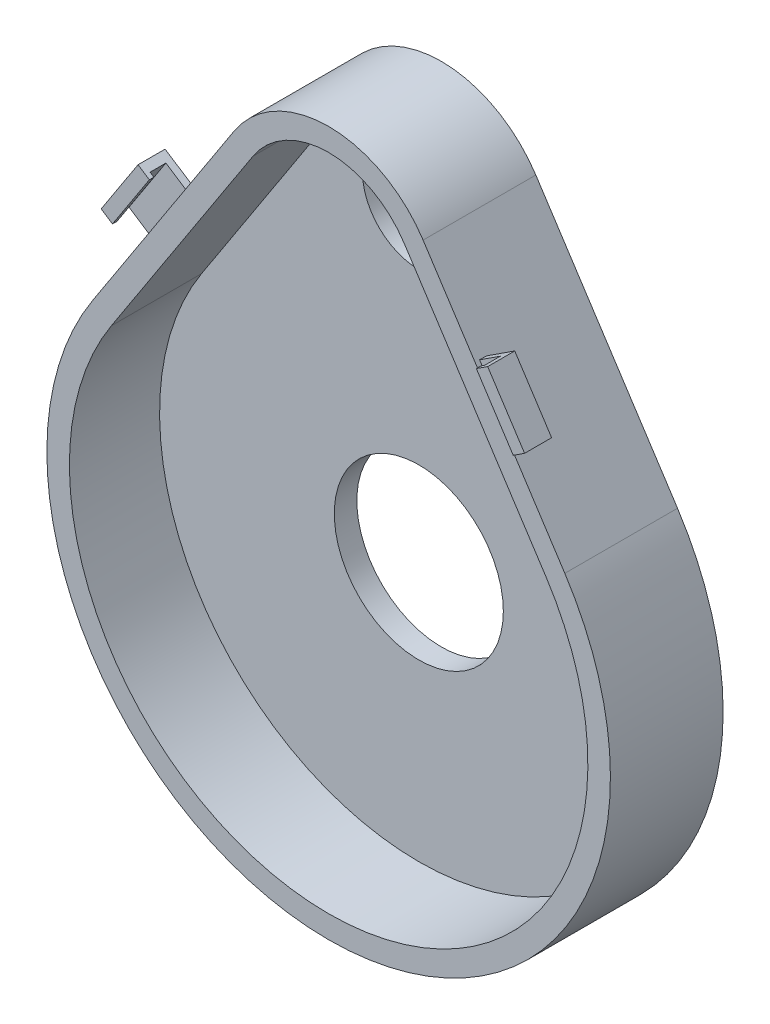
ISO-10303-21;
HEADER;
FILE_DESCRIPTION(('STEP AP214'),'2;1');
FILE_NAME('part.step','',(''),(''),'','','');
FILE_SCHEMA(('AUTOMOTIVE_DESIGN { 1 0 10303 214 1 1 1 1 }'));
ENDSEC;
DATA;
#1=APPLICATION_CONTEXT('core data for automotive mechanical design processes');
#2=APPLICATION_PROTOCOL_DEFINITION('international standard','automotive_design',2000,#1);
#3=PRODUCT_CONTEXT('',#1,'mechanical');
#4=PRODUCT('Part','Part','',(#3));
#5=PRODUCT_RELATED_PRODUCT_CATEGORY('part','',(#4));
#6=PRODUCT_DEFINITION_FORMATION('','',#4);
#7=PRODUCT_DEFINITION_CONTEXT('part definition',#1,'design');
#8=PRODUCT_DEFINITION('design','',#6,#7);
#9=PRODUCT_DEFINITION_SHAPE('','',#8);
#10=(LENGTH_UNIT() NAMED_UNIT(*) SI_UNIT(.MILLI.,.METRE.));
#11=(NAMED_UNIT(*) PLANE_ANGLE_UNIT() SI_UNIT($,.RADIAN.));
#12=(NAMED_UNIT(*) SI_UNIT($,.STERADIAN.) SOLID_ANGLE_UNIT());
#13=UNCERTAINTY_MEASURE_WITH_UNIT(LENGTH_MEASURE(1.E-05),#10,'distance_accuracy_value','');
#14=(GEOMETRIC_REPRESENTATION_CONTEXT(3) GLOBAL_UNCERTAINTY_ASSIGNED_CONTEXT((#13)) GLOBAL_UNIT_ASSIGNED_CONTEXT((#10,
#11,#12)) REPRESENTATION_CONTEXT('',''));
#15=CARTESIAN_POINT('',(0.,0.,0.));
#16=DIRECTION('',(0.,0.,1.));
#17=DIRECTION('',(1.,0.,0.));
#18=AXIS2_PLACEMENT_3D('',#15,#16,#17);
#19=CARTESIAN_POINT('',(0.,0.,7.239));
#20=DIRECTION('',(0.,0.,1.));
#21=DIRECTION('',(1.,0.,0.));
#22=AXIS2_PLACEMENT_3D('',#19,#20,#21);
#23=PLANE('',#22);
#24=DIRECTION('',(0.838140405208444,-0.545454545454546,0.));
#25=VECTOR('',#24,1.);
#26=CARTESIAN_POINT('',(-11.9273669292934,14.2691850561558,7.239));
#27=LINE('',#26,#25);
#28=CARTESIAN_POINT('',(-11.9273669292934,14.2691850561558,7.239));
#29=VERTEX_POINT('',#28);
#30=CARTESIAN_POINT('',(-11.2887039405245,13.8535486925195,7.239));
#31=VERTEX_POINT('',#30);
#32=EDGE_CURVE('E216',#29,#31,#27,.T.);
#33=ORIENTED_EDGE('',*,*,#32,.T.);
#34=DIRECTION('',(0.545454545454546,0.838140405208444,0.));
#35=VECTOR('',#34,1.);
#36=CARTESIAN_POINT('',(-26.2449025631422,-9.12800765970158,7.239));
#37=LINE('',#36,#35);
#38=CARTESIAN_POINT('',(-9.2105221223427,17.0468636363636,7.239));
#39=VERTEX_POINT('',#38);
#40=EDGE_CURVE('E204',#31,#39,#37,.T.);
#41=ORIENTED_EDGE('',*,*,#40,.T.);
#42=DIRECTION('',(-0.838140405208444,0.545454545454546,0.));
#43=VECTOR('',#42,1.);
#44=CARTESIAN_POINT('',(-8.25252763918945,16.4234090909091,7.239));
#45=LINE('',#44,#43);
#46=CARTESIAN_POINT('',(-9.84918511111154,17.4625,7.239));
#47=VERTEX_POINT('',#46);
#48=EDGE_CURVE('E226',#39,#47,#45,.T.);
#49=ORIENTED_EDGE('',*,*,#48,.T.);
#50=DIRECTION('',(-0.545454545454546,-0.838140405208444,0.));
#51=VECTOR('',#50,1.);
#52=CARTESIAN_POINT('',(-9.84918511111154,17.4625,7.239));
#53=LINE('',#52,#51);
#54=EDGE_CURVE('E228',#47,#29,#53,.T.);
#55=ORIENTED_EDGE('',*,*,#54,.T.);
#56=EDGE_LOOP('',(#33,#41,#49,#55));
#57=FACE_BOUND('',#56,.T.);
#58=ADVANCED_FACE('F39',(#57),#23,.T.);
#59=CARTESIAN_POINT('',(0.,0.,7.239));
#60=DIRECTION('',(0.,0.,-1.));
#61=DIRECTION('',(-1.,0.,0.));
#62=AXIS2_PLACEMENT_3D('',#59,#60,#61);
#63=PLANE('',#62);
#64=DIRECTION('',(-0.545454545454546,0.838140405208444,0.));
#65=VECTOR('',#64,1.);
#66=CARTESIAN_POINT('',(26.2449025631422,-9.12800765970158,7.239));
#67=LINE('',#66,#65);
#68=CARTESIAN_POINT('',(11.2887039405245,13.8535486925195,7.239));
#69=VERTEX_POINT('',#68);
#70=CARTESIAN_POINT('',(9.2105221223427,17.0468636363636,7.239));
#71=VERTEX_POINT('',#70);
#72=EDGE_CURVE('E660',#69,#71,#67,.T.);
#73=ORIENTED_EDGE('',*,*,#72,.F.);
#74=DIRECTION('',(0.838140405208444,0.545454545454546,0.));
#75=VECTOR('',#74,1.);
#76=CARTESIAN_POINT('',(11.9273669292934,14.2691850561558,7.239));
#77=LINE('',#76,#75);
#78=CARTESIAN_POINT('',(11.9273669292934,14.2691850561558,7.239));
#79=VERTEX_POINT('',#78);
#80=EDGE_CURVE('E667',#69,#79,#77,.T.);
#81=ORIENTED_EDGE('',*,*,#80,.T.);
#82=DIRECTION('',(-0.545454545454546,0.838140405208444,0.));
#83=VECTOR('',#82,1.);
#84=CARTESIAN_POINT('',(9.84918511111154,17.4625,7.239));
#85=LINE('',#84,#83);
#86=CARTESIAN_POINT('',(9.84918511111154,17.4625,7.239));
#87=VERTEX_POINT('',#86);
#88=EDGE_CURVE('E669',#79,#87,#85,.T.);
#89=ORIENTED_EDGE('',*,*,#88,.T.);
#90=DIRECTION('',(-0.838140405208444,-0.545454545454546,0.));
#91=VECTOR('',#90,1.);
#92=CARTESIAN_POINT('',(8.25252763918945,16.4234090909091,7.239));
#93=LINE('',#92,#91);
#94=EDGE_CURVE('E672',#87,#71,#93,.T.);
#95=ORIENTED_EDGE('',*,*,#94,.T.);
#96=EDGE_LOOP('',(#73,#81,#89,#95));
#97=FACE_BOUND('',#96,.T.);
#98=ADVANCED_FACE('F376',(#97),#63,.F.);
#99=CARTESIAN_POINT('',(11.9273669292934,14.2691850561558,7.239));
#100=DIRECTION('',(-0.545454545454546,0.838140405208444,0.));
#101=DIRECTION('',(-0.838140405208444,-0.545454545454546,0.));
#102=AXIS2_PLACEMENT_3D('',#99,#100,#101);
#103=PLANE('',#102);
#104=DIRECTION('',(0.838140405208444,0.545454545454546,0.));
#105=VECTOR('',#104,1.);
#106=CARTESIAN_POINT('',(10.3307094573713,13.2300941470649,6.096));
#107=LINE('',#106,#105);
#108=CARTESIAN_POINT('',(10.3307094573713,13.2300941470649,6.096));
#109=VERTEX_POINT('',#108);
#110=CARTESIAN_POINT('',(11.5015916034475,13.9920941470649,6.096));
#111=VERTEX_POINT('',#110);
#112=EDGE_CURVE('E653',#109,#111,#107,.T.);
#113=ORIENTED_EDGE('',*,*,#112,.F.);
#114=DIRECTION('',(0.,0.,-1.));
#115=VECTOR('',#114,1.);
#116=CARTESIAN_POINT('',(10.3307094573713,13.2300941470649,7.239));
#117=LINE('',#116,#115);
#118=CARTESIAN_POINT('',(10.3307094573713,13.2300941470649,5.715));
#119=VERTEX_POINT('',#118);
#120=EDGE_CURVE('E688',#109,#119,#117,.T.);
#121=ORIENTED_EDGE('',*,*,#120,.T.);
#122=DIRECTION('',(0.838140405208444,0.545454545454546,0.));
#123=VECTOR('',#122,1.);
#124=CARTESIAN_POINT('',(11.9273669292934,14.2691850561558,5.715));
#125=LINE('',#124,#123);
#126=CARTESIAN_POINT('',(11.9273669292934,14.2691850561558,5.715));
#127=VERTEX_POINT('',#126);
#128=EDGE_CURVE('E680',#119,#127,#125,.T.);
#129=ORIENTED_EDGE('',*,*,#128,.T.);
#130=DIRECTION('',(0.,0.,-1.));
#131=VECTOR('',#130,1.);
#132=CARTESIAN_POINT('',(11.9273669292934,14.2691850561558,7.239));
#133=LINE('',#132,#131);
#134=EDGE_CURVE('E243',#79,#127,#133,.T.);
#135=ORIENTED_EDGE('',*,*,#134,.F.);
#136=ORIENTED_EDGE('',*,*,#80,.F.);
#137=DIRECTION('',(0.,0.,1.));
#138=VECTOR('',#137,1.);
#139=CARTESIAN_POINT('',(11.2887039405245,13.8535486925195,6.985));
#140=LINE('',#139,#138);
#141=CARTESIAN_POINT('',(11.2887039405245,13.8535486925195,6.985));
#142=VERTEX_POINT('',#141);
#143=EDGE_CURVE('E639',#142,#69,#140,.T.);
#144=ORIENTED_EDGE('',*,*,#143,.F.);
#145=DIRECTION('',(-0.838140405208444,-0.545454545454546,0.));
#146=VECTOR('',#145,1.);
#147=CARTESIAN_POINT('',(11.5015916034475,13.9920941470649,6.985));
#148=LINE('',#147,#146);
#149=CARTESIAN_POINT('',(11.5015916034475,13.9920941470649,6.985));
#150=VERTEX_POINT('',#149);
#151=EDGE_CURVE('E640',#150,#142,#148,.T.);
#152=ORIENTED_EDGE('',*,*,#151,.F.);
#153=DIRECTION('',(0.,0.,1.));
#154=VECTOR('',#153,1.);
#155=CARTESIAN_POINT('',(11.5015916034475,13.9920941470649,6.096));
#156=LINE('',#155,#154);
#157=EDGE_CURVE('E632',#111,#150,#156,.T.);
#158=ORIENTED_EDGE('',*,*,#157,.F.);
#159=EDGE_LOOP('',(#113,#121,#129,#135,#136,#144,#152,#158));
#160=FACE_BOUND('',#159,.T.);
#161=ADVANCED_FACE('F385',(#160),#103,.F.);
#162=CARTESIAN_POINT('',(8.25252763918945,16.4234090909091,7.239));
#163=DIRECTION('',(0.545454545454546,-0.838140405208444,0.));
#164=DIRECTION('',(0.838140405208444,0.545454545454546,0.));
#165=AXIS2_PLACEMENT_3D('',#162,#163,#164);
#166=PLANE('',#165);
#167=DIRECTION('',(0.,0.,-1.));
#168=VECTOR('',#167,1.);
#169=CARTESIAN_POINT('',(9.2105221223427,17.0468636363636,6.985));
#170=LINE('',#169,#168);
#171=CARTESIAN_POINT('',(9.2105221223427,17.0468636363636,6.985));
#172=VERTEX_POINT('',#171);
#173=EDGE_CURVE('E61',#71,#172,#170,.T.);
#174=ORIENTED_EDGE('',*,*,#173,.F.);
#175=ORIENTED_EDGE('',*,*,#94,.F.);
#176=DIRECTION('',(0.,0.,-1.));
#177=VECTOR('',#176,1.);
#178=CARTESIAN_POINT('',(9.84918511111154,17.4625,7.239));
#179=LINE('',#178,#177);
#180=CARTESIAN_POINT('',(9.84918511111154,17.4625,5.715));
#181=VERTEX_POINT('',#180);
#182=EDGE_CURVE('E671',#87,#181,#179,.T.);
#183=ORIENTED_EDGE('',*,*,#182,.T.);
#184=DIRECTION('',(-0.838140405208444,-0.545454545454546,0.));
#185=VECTOR('',#184,1.);
#186=CARTESIAN_POINT('',(8.25252763918945,16.4234090909091,5.715));
#187=LINE('',#186,#185);
#188=CARTESIAN_POINT('',(8.25252763918945,16.4234090909091,5.715));
#189=VERTEX_POINT('',#188);
#190=EDGE_CURVE('E666',#181,#189,#187,.T.);
#191=ORIENTED_EDGE('',*,*,#190,.T.);
#192=DIRECTION('',(0.,0.,-1.));
#193=VECTOR('',#192,1.);
#194=CARTESIAN_POINT('',(8.25252763918945,16.4234090909091,7.239));
#195=LINE('',#194,#193);
#196=CARTESIAN_POINT('',(8.25252763918945,16.4234090909091,6.096));
#197=VERTEX_POINT('',#196);
#198=EDGE_CURVE('E298',#197,#189,#195,.T.);
#199=ORIENTED_EDGE('',*,*,#198,.F.);
#200=DIRECTION('',(-0.838140405208445,-0.545454545454544,0.));
#201=VECTOR('',#200,1.);
#202=CARTESIAN_POINT('',(8.25252763918945,16.4234090909091,6.096));
#203=LINE('',#202,#201);
#204=CARTESIAN_POINT('',(9.42340978526565,17.1854090909091,6.096));
#205=VERTEX_POINT('',#204);
#206=EDGE_CURVE('E643',#205,#197,#203,.T.);
#207=ORIENTED_EDGE('',*,*,#206,.F.);
#208=DIRECTION('',(0.,0.,-1.));
#209=VECTOR('',#208,1.);
#210=CARTESIAN_POINT('',(9.42340978526565,17.1854090909091,6.096));
#211=LINE('',#210,#209);
#212=CARTESIAN_POINT('',(9.42340978526565,17.1854090909091,6.985));
#213=VERTEX_POINT('',#212);
#214=EDGE_CURVE('E645',#213,#205,#211,.T.);
#215=ORIENTED_EDGE('',*,*,#214,.F.);
#216=DIRECTION('',(0.838140405208449,0.545454545454538,0.));
#217=VECTOR('',#216,1.);
#218=CARTESIAN_POINT('',(9.42340978526565,17.1854090909091,6.985));
#219=LINE('',#218,#217);
#220=EDGE_CURVE('E646',#172,#213,#219,.T.);
#221=ORIENTED_EDGE('',*,*,#220,.F.);
#222=EDGE_LOOP('',(#174,#175,#183,#191,#199,#207,#215,#221));
#223=FACE_BOUND('',#222,.T.);
#224=ADVANCED_FACE('F438',(#223),#166,.F.);
#225=CARTESIAN_POINT('',(13.3054789326841,8.65909090909092,6.35));
#226=DIRECTION('',(-0.838140405208444,-0.545454545454546,0.));
#227=DIRECTION('',(0.545454545454546,-0.838140405208444,0.));
#228=AXIS2_PLACEMENT_3D('',#225,#226,#227);
#229=PLANE('',#228);
#230=ORIENTED_EDGE('',*,*,#120,.F.);
#231=DIRECTION('',(-0.545454545454546,0.838140405208444,0.));
#232=VECTOR('',#231,1.);
#233=CARTESIAN_POINT('',(25.286908079989,-9.75146220515613,6.096));
#234=LINE('',#233,#232);
#235=EDGE_CURVE('E657',#109,#197,#234,.T.);
#236=ORIENTED_EDGE('',*,*,#235,.T.);
#237=ORIENTED_EDGE('',*,*,#198,.T.);
#238=DIRECTION('',(0.545454545454546,-0.838140405208444,0.));
#239=VECTOR('',#238,1.);
#240=CARTESIAN_POINT('',(8.25252763918945,16.4234090909091,5.715));
#241=LINE('',#240,#239);
#242=EDGE_CURVE('E673',#189,#119,#241,.T.);
#243=ORIENTED_EDGE('',*,*,#242,.T.);
#244=EDGE_LOOP('',(#230,#236,#237,#243));
#245=FACE_BOUND('',#244,.T.);
#246=DIRECTION('',(0.,0.,-1.));
#247=VECTOR('',#246,1.);
#248=CARTESIAN_POINT('',(5.32219157307362,20.9261363636364,6.35));
#249=LINE('',#248,#247);
#250=CARTESIAN_POINT('',(5.32219157307362,20.9261363636364,6.35));
#251=VERTEX_POINT('',#250);
#252=CARTESIAN_POINT('',(5.32219157307362,20.9261363636364,0.));
#253=VERTEX_POINT('',#252);
#254=EDGE_CURVE('E297',#251,#253,#249,.T.);
#255=ORIENTED_EDGE('',*,*,#254,.F.);
#256=DIRECTION('',(-0.545454545454546,0.838140405208444,0.));
#257=VECTOR('',#256,1.);
#258=CARTESIAN_POINT('',(13.3054789326841,8.65909090909092,6.35));
#259=LINE('',#258,#257);
#260=CARTESIAN_POINT('',(13.3054789326841,8.65909090909092,6.35));
#261=VERTEX_POINT('',#260);
#262=EDGE_CURVE('E282',#261,#251,#259,.T.);
#263=ORIENTED_EDGE('',*,*,#262,.F.);
#264=DIRECTION('',(0.,0.,-1.));
#265=VECTOR('',#264,1.);
#266=CARTESIAN_POINT('',(13.3054789326841,8.65909090909092,6.35));
#267=LINE('',#266,#265);
#268=CARTESIAN_POINT('',(13.3054789326841,8.65909090909092,0.));
#269=VERTEX_POINT('',#268);
#270=EDGE_CURVE('E300',#261,#269,#267,.T.);
#271=ORIENTED_EDGE('',*,*,#270,.T.);
#272=DIRECTION('',(-0.545454545454546,0.838140405208444,0.));
#273=VECTOR('',#272,1.);
#274=CARTESIAN_POINT('',(13.3054789326841,8.65909090909092,0.));
#275=LINE('',#274,#273);
#276=EDGE_CURVE('E293',#269,#253,#275,.T.);
#277=ORIENTED_EDGE('',*,*,#276,.T.);
#278=EDGE_LOOP('',(#255,#263,#271,#277));
#279=FACE_BOUND('',#278,.T.);
#280=ADVANCED_FACE('F338',(#245,#279),#229,.F.);
#281=CARTESIAN_POINT('',(0.,17.4625,6.35));
#282=DIRECTION('',(0.,0.,1.));
#283=DIRECTION('',(1.,0.,0.));
#284=AXIS2_PLACEMENT_3D('',#281,#282,#283);
#285=PLANE('',#284);
#286=DIRECTION('',(0.545454545454546,0.838140405208444,0.));
#287=VECTOR('',#286,1.);
#288=CARTESIAN_POINT('',(-13.3054789326841,8.65909090909091,6.35));
#289=LINE('',#288,#287);
#290=CARTESIAN_POINT('',(-13.3054789326841,8.65909090909091,6.35));
#291=VERTEX_POINT('',#290);
#292=CARTESIAN_POINT('',(-5.32219157307362,20.9261363636363,6.35));
#293=VERTEX_POINT('',#292);
#294=EDGE_CURVE('E273',#291,#293,#289,.T.);
#295=ORIENTED_EDGE('',*,*,#294,.F.);
#296=CARTESIAN_POINT('',(0.,0.,6.35));
#297=DIRECTION('',(0.,0.,1.));
#298=DIRECTION('',(1.,0.,0.));
#299=AXIS2_PLACEMENT_3D('',#296,#297,#298);
#300=CIRCLE('',#299,15.875);
#301=EDGE_CURVE('E285',#291,#261,#300,.T.);
#302=ORIENTED_EDGE('',*,*,#301,.T.);
#303=ORIENTED_EDGE('',*,*,#262,.T.);
#304=CARTESIAN_POINT('',(0.,17.4625,6.35));
#305=DIRECTION('',(0.,0.,1.));
#306=DIRECTION('',(1.,0.,0.));
#307=AXIS2_PLACEMENT_3D('',#304,#305,#306);
#308=CIRCLE('',#307,6.35);
#309=EDGE_CURVE('E280',#251,#293,#308,.T.);
#310=ORIENTED_EDGE('',*,*,#309,.T.);
#311=EDGE_LOOP('',(#295,#302,#303,#310));
#312=FACE_BOUND('',#311,.T.);
#313=CARTESIAN_POINT('',(0.,0.,6.35));
#314=DIRECTION('',(0.,0.,1.));
#315=DIRECTION('',(1.,0.,0.));
#316=AXIS2_PLACEMENT_3D('',#313,#314,#315);
#317=CIRCLE('',#316,14.605);
#318=CARTESIAN_POINT('',(-12.2410406180693,7.96636363636363,6.35));
#319=VERTEX_POINT('',#318);
#320=CARTESIAN_POINT('',(12.2410406180693,7.96636363636365,6.35));
#321=VERTEX_POINT('',#320);
#322=EDGE_CURVE('E253',#319,#321,#317,.T.);
#323=ORIENTED_EDGE('',*,*,#322,.F.);
#324=DIRECTION('',(0.545454545454546,0.838140405208444,0.));
#325=VECTOR('',#324,1.);
#326=CARTESIAN_POINT('',(-12.2410406180693,7.96636363636363,6.35));
#327=LINE('',#326,#325);
#328=CARTESIAN_POINT('',(-4.2577532584589,20.2334090909091,6.35));
#329=VERTEX_POINT('',#328);
#330=EDGE_CURVE('E259',#319,#329,#327,.T.);
#331=ORIENTED_EDGE('',*,*,#330,.T.);
#332=CARTESIAN_POINT('',(0.,17.4625,6.35));
#333=DIRECTION('',(0.,0.,1.));
#334=DIRECTION('',(1.,0.,0.));
#335=AXIS2_PLACEMENT_3D('',#332,#333,#334);
#336=CIRCLE('',#335,5.08);
#337=CARTESIAN_POINT('',(4.2577532584589,20.2334090909091,6.35));
#338=VERTEX_POINT('',#337);
#339=EDGE_CURVE('E268',#338,#329,#336,.T.);
#340=ORIENTED_EDGE('',*,*,#339,.F.);
#341=DIRECTION('',(-0.545454545454546,0.838140405208444,0.));
#342=VECTOR('',#341,1.);
#343=CARTESIAN_POINT('',(12.2410406180693,7.96636363636364,6.35));
#344=LINE('',#343,#342);
#345=EDGE_CURVE('E272',#321,#338,#344,.T.);
#346=ORIENTED_EDGE('',*,*,#345,.F.);
#347=EDGE_LOOP('',(#323,#331,#340,#346));
#348=FACE_BOUND('',#347,.T.);
#349=ADVANCED_FACE('F343',(#312,#348),#285,.T.);
#350=CARTESIAN_POINT('',(-13.3054789326841,8.65909090909091,6.35));
#351=DIRECTION('',(-0.838140405208444,0.545454545454546,0.));
#352=DIRECTION('',(-0.545454545454546,-0.838140405208444,0.));
#353=AXIS2_PLACEMENT_3D('',#350,#351,#352);
#354=PLANE('',#353);
#355=DIRECTION('',(0.,0.,-1.));
#356=VECTOR('',#355,1.);
#357=CARTESIAN_POINT('',(-8.25252763918945,16.4234090909091,7.239));
#358=LINE('',#357,#356);
#359=CARTESIAN_POINT('',(-8.25252763918945,16.4234090909091,6.096));
#360=VERTEX_POINT('',#359);
#361=CARTESIAN_POINT('',(-8.25252763918945,16.4234090909091,5.715));
#362=VERTEX_POINT('',#361);
#363=EDGE_CURVE('E11',#360,#362,#358,.T.);
#364=ORIENTED_EDGE('',*,*,#363,.F.);
#365=DIRECTION('',(0.545454545454546,0.838140405208444,0.));
#366=VECTOR('',#365,1.);
#367=CARTESIAN_POINT('',(-25.286908079989,-9.75146220515613,6.096));
#368=LINE('',#367,#366);
#369=CARTESIAN_POINT('',(-10.3307094573713,13.2300941470649,6.096));
#370=VERTEX_POINT('',#369);
#371=EDGE_CURVE('E212',#370,#360,#368,.T.);
#372=ORIENTED_EDGE('',*,*,#371,.F.);
#373=DIRECTION('',(0.,0.,-1.));
#374=VECTOR('',#373,1.);
#375=CARTESIAN_POINT('',(-10.3307094573713,13.2300941470649,7.239));
#376=LINE('',#375,#374);
#377=CARTESIAN_POINT('',(-10.3307094573713,13.2300941470649,5.715));
#378=VERTEX_POINT('',#377);
#379=EDGE_CURVE('E48',#370,#378,#376,.T.);
#380=ORIENTED_EDGE('',*,*,#379,.T.);
#381=DIRECTION('',(0.545454545454546,0.838140405208444,0.));
#382=VECTOR('',#381,1.);
#383=CARTESIAN_POINT('',(-8.25252763918945,16.4234090909091,5.715));
#384=LINE('',#383,#382);
#385=EDGE_CURVE('E700',#378,#362,#384,.T.);
#386=ORIENTED_EDGE('',*,*,#385,.T.);
#387=EDGE_LOOP('',(#364,#372,#380,#386));
#388=FACE_BOUND('',#387,.T.);
#389=ORIENTED_EDGE('',*,*,#294,.T.);
#390=DIRECTION('',(0.,0.,-1.));
#391=VECTOR('',#390,1.);
#392=CARTESIAN_POINT('',(-5.32219157307362,20.9261363636363,6.35));
#393=LINE('',#392,#391);
#394=CARTESIAN_POINT('',(-5.32219157307362,20.9261363636363,0.));
#395=VERTEX_POINT('',#394);
#396=EDGE_CURVE('E283',#293,#395,#393,.T.);
#397=ORIENTED_EDGE('',*,*,#396,.T.);
#398=DIRECTION('',(0.545454545454546,0.838140405208444,0.));
#399=VECTOR('',#398,1.);
#400=CARTESIAN_POINT('',(-13.3054789326841,8.65909090909091,0.));
#401=LINE('',#400,#399);
#402=CARTESIAN_POINT('',(-13.3054789326841,8.65909090909091,0.));
#403=VERTEX_POINT('',#402);
#404=EDGE_CURVE('E249',#403,#395,#401,.T.);
#405=ORIENTED_EDGE('',*,*,#404,.F.);
#406=DIRECTION('',(0.,0.,-1.));
#407=VECTOR('',#406,1.);
#408=CARTESIAN_POINT('',(-13.3054789326841,8.65909090909091,6.35));
#409=LINE('',#408,#407);
#410=EDGE_CURVE('E295',#291,#403,#409,.T.);
#411=ORIENTED_EDGE('',*,*,#410,.F.);
#412=EDGE_LOOP('',(#389,#397,#405,#411));
#413=FACE_BOUND('',#412,.T.);
#414=ADVANCED_FACE('F41',(#388,#413),#354,.T.);
#415=CARTESIAN_POINT('',(0.,0.,6.35));
#416=DIRECTION('',(0.,0.,-1.));
#417=DIRECTION('',(-1.,0.,0.));
#418=AXIS2_PLACEMENT_3D('',#415,#416,#417);
#419=CYLINDRICAL_SURFACE('',#418,15.875);
#420=CARTESIAN_POINT('',(0.,0.,0.));
#421=DIRECTION('',(0.,0.,1.));
#422=DIRECTION('',(1.,0.,0.));
#423=AXIS2_PLACEMENT_3D('',#420,#421,#422);
#424=CIRCLE('',#423,15.875);
#425=EDGE_CURVE('E279',#403,#269,#424,.T.);
#426=ORIENTED_EDGE('',*,*,#425,.T.);
#427=ORIENTED_EDGE('',*,*,#270,.F.);
#428=ORIENTED_EDGE('',*,*,#301,.F.);
#429=ORIENTED_EDGE('',*,*,#410,.T.);
#430=EDGE_LOOP('',(#426,#427,#428,#429));
#431=FACE_BOUND('',#430,.T.);
#432=ADVANCED_FACE('F344',(#431),#419,.T.);
#433=CARTESIAN_POINT('',(0.,17.4625,6.35));
#434=DIRECTION('',(0.,0.,-1.));
#435=DIRECTION('',(-1.,0.,0.));
#436=AXIS2_PLACEMENT_3D('',#433,#434,#435);
#437=CYLINDRICAL_SURFACE('',#436,6.35);
#438=CARTESIAN_POINT('',(0.,17.4625,0.));
#439=DIRECTION('',(0.,0.,1.));
#440=DIRECTION('',(1.,0.,0.));
#441=AXIS2_PLACEMENT_3D('',#438,#439,#440);
#442=CIRCLE('',#441,6.35);
#443=EDGE_CURVE('E290',#253,#395,#442,.T.);
#444=ORIENTED_EDGE('',*,*,#443,.T.);
#445=ORIENTED_EDGE('',*,*,#396,.F.);
#446=ORIENTED_EDGE('',*,*,#309,.F.);
#447=ORIENTED_EDGE('',*,*,#254,.T.);
#448=EDGE_LOOP('',(#444,#445,#446,#447));
#449=FACE_BOUND('',#448,.T.);
#450=ADVANCED_FACE('F324',(#449),#437,.T.);
#451=CARTESIAN_POINT('',(0.,17.4625,0.));
#452=DIRECTION('',(0.,0.,1.));
#453=DIRECTION('',(1.,0.,0.));
#454=AXIS2_PLACEMENT_3D('',#451,#452,#453);
#455=PLANE('',#454);
#456=CARTESIAN_POINT('',(0.,17.4625,0.));
#457=DIRECTION('',(0.,0.,1.));
#458=DIRECTION('',(1.,0.,0.));
#459=AXIS2_PLACEMENT_3D('',#456,#457,#458);
#460=CIRCLE('',#459,3.175);
#461=CARTESIAN_POINT('',(3.175,17.4625,0.));
#462=VERTEX_POINT('',#461);
#463=EDGE_CURVE('E236',#462,#462,#460,.T.);
#464=ORIENTED_EDGE('',*,*,#463,.T.);
#465=EDGE_LOOP('',(#464));
#466=FACE_BOUND('',#465,.T.);
#467=CARTESIAN_POINT('',(0.,0.,0.));
#468=DIRECTION('',(0.,0.,1.));
#469=DIRECTION('',(1.,0.,0.));
#470=AXIS2_PLACEMENT_3D('',#467,#468,#469);
#471=CIRCLE('',#470,4.7625);
#472=CARTESIAN_POINT('',(4.7625,0.,0.));
#473=VERTEX_POINT('',#472);
#474=EDGE_CURVE('E239',#473,#473,#471,.T.);
#475=ORIENTED_EDGE('',*,*,#474,.T.);
#476=EDGE_LOOP('',(#475));
#477=FACE_BOUND('',#476,.T.);
#478=ORIENTED_EDGE('',*,*,#404,.T.);
#479=ORIENTED_EDGE('',*,*,#443,.F.);
#480=ORIENTED_EDGE('',*,*,#276,.F.);
#481=ORIENTED_EDGE('',*,*,#425,.F.);
#482=EDGE_LOOP('',(#478,#479,#480,#481));
#483=FACE_BOUND('',#482,.T.);
#484=ADVANCED_FACE('F316',(#466,#477,#483),#455,.F.);
#485=CARTESIAN_POINT('',(-12.2410406180693,7.96636363636363,6.35));
#486=DIRECTION('',(-0.838140405208444,0.545454545454546,0.));
#487=DIRECTION('',(-0.545454545454546,-0.838140405208444,0.));
#488=AXIS2_PLACEMENT_3D('',#485,#486,#487);
#489=PLANE('',#488);
#490=DIRECTION('',(0.545454545454546,0.838140405208444,0.));
#491=VECTOR('',#490,1.);
#492=CARTESIAN_POINT('',(-12.2410406180693,7.96636363636363,1.27));
#493=LINE('',#492,#491);
#494=CARTESIAN_POINT('',(-12.2410406180693,7.96636363636364,1.27));
#495=VERTEX_POINT('',#494);
#496=CARTESIAN_POINT('',(-4.2577532584589,20.2334090909091,1.27));
#497=VERTEX_POINT('',#496);
#498=EDGE_CURVE('E242',#495,#497,#493,.T.);
#499=ORIENTED_EDGE('',*,*,#498,.T.);
#500=DIRECTION('',(0.,0.,1.));
#501=VECTOR('',#500,1.);
#502=CARTESIAN_POINT('',(-4.2577532584589,20.2334090909091,6.35));
#503=LINE('',#502,#501);
#504=EDGE_CURVE('E255',#329,#497,#503,.F.);
#505=ORIENTED_EDGE('',*,*,#504,.F.);
#506=ORIENTED_EDGE('',*,*,#330,.F.);
#507=DIRECTION('',(0.,0.,-1.));
#508=VECTOR('',#507,1.);
#509=CARTESIAN_POINT('',(-12.2410406180693,7.96636363636364,6.35));
#510=LINE('',#509,#508);
#511=EDGE_CURVE('E247',#319,#495,#510,.T.);
#512=ORIENTED_EDGE('',*,*,#511,.T.);
#513=EDGE_LOOP('',(#499,#505,#506,#512));
#514=FACE_BOUND('',#513,.T.);
#515=ADVANCED_FACE('F325',(#514),#489,.F.);
#516=CARTESIAN_POINT('',(0.,0.,6.35));
#517=DIRECTION('',(0.,0.,-1.));
#518=DIRECTION('',(-1.,0.,0.));
#519=AXIS2_PLACEMENT_3D('',#516,#517,#518);
#520=CYLINDRICAL_SURFACE('',#519,14.605);
#521=CARTESIAN_POINT('',(0.,0.,1.27));
#522=DIRECTION('',(0.,0.,1.));
#523=DIRECTION('',(1.,0.,0.));
#524=AXIS2_PLACEMENT_3D('',#521,#522,#523);
#525=CIRCLE('',#524,14.605);
#526=CARTESIAN_POINT('',(12.2410406180693,7.96636363636365,1.27));
#527=VERTEX_POINT('',#526);
#528=EDGE_CURVE('E257',#495,#527,#525,.T.);
#529=ORIENTED_EDGE('',*,*,#528,.F.);
#530=ORIENTED_EDGE('',*,*,#511,.F.);
#531=ORIENTED_EDGE('',*,*,#322,.T.);
#532=DIRECTION('',(0.,0.,1.));
#533=VECTOR('',#532,1.);
#534=CARTESIAN_POINT('',(12.2410406180693,7.96636363636365,6.35));
#535=LINE('',#534,#533);
#536=EDGE_CURVE('E252',#321,#527,#535,.F.);
#537=ORIENTED_EDGE('',*,*,#536,.T.);
#538=EDGE_LOOP('',(#529,#530,#531,#537));
#539=FACE_BOUND('',#538,.T.);
#540=ADVANCED_FACE('F358',(#539),#520,.F.);
#541=CARTESIAN_POINT('',(12.2410406180693,7.96636363636364,6.35));
#542=DIRECTION('',(-0.838140405208444,-0.545454545454546,0.));
#543=DIRECTION('',(0.545454545454546,-0.838140405208444,0.));
#544=AXIS2_PLACEMENT_3D('',#541,#542,#543);
#545=PLANE('',#544);
#546=DIRECTION('',(-0.545454545454546,0.838140405208444,0.));
#547=VECTOR('',#546,1.);
#548=CARTESIAN_POINT('',(12.2410406180693,7.96636363636364,1.27));
#549=LINE('',#548,#547);
#550=CARTESIAN_POINT('',(4.25775325845889,20.2334090909091,1.27));
#551=VERTEX_POINT('',#550);
#552=EDGE_CURVE('E256',#527,#551,#549,.T.);
#553=ORIENTED_EDGE('',*,*,#552,.F.);
#554=ORIENTED_EDGE('',*,*,#536,.F.);
#555=ORIENTED_EDGE('',*,*,#345,.T.);
#556=DIRECTION('',(0.,0.,-1.));
#557=VECTOR('',#556,1.);
#558=CARTESIAN_POINT('',(4.25775325845889,20.2334090909091,6.35));
#559=LINE('',#558,#557);
#560=EDGE_CURVE('E251',#338,#551,#559,.T.);
#561=ORIENTED_EDGE('',*,*,#560,.T.);
#562=EDGE_LOOP('',(#553,#554,#555,#561));
#563=FACE_BOUND('',#562,.T.);
#564=ADVANCED_FACE('F360',(#563),#545,.T.);
#565=CARTESIAN_POINT('',(0.,17.4625,6.35));
#566=DIRECTION('',(0.,0.,-1.));
#567=DIRECTION('',(-1.,0.,0.));
#568=AXIS2_PLACEMENT_3D('',#565,#566,#567);
#569=CYLINDRICAL_SURFACE('',#568,5.08);
#570=CARTESIAN_POINT('',(0.,17.4625,1.27));
#571=DIRECTION('',(0.,0.,1.));
#572=DIRECTION('',(1.,0.,0.));
#573=AXIS2_PLACEMENT_3D('',#570,#571,#572);
#574=CIRCLE('',#573,5.08);
#575=EDGE_CURVE('E250',#551,#497,#574,.T.);
#576=ORIENTED_EDGE('',*,*,#575,.F.);
#577=ORIENTED_EDGE('',*,*,#560,.F.);
#578=ORIENTED_EDGE('',*,*,#339,.T.);
#579=ORIENTED_EDGE('',*,*,#504,.T.);
#580=EDGE_LOOP('',(#576,#577,#578,#579));
#581=FACE_BOUND('',#580,.T.);
#582=ADVANCED_FACE('F366',(#581),#569,.F.);
#583=CARTESIAN_POINT('',(0.,17.4625,1.27));
#584=DIRECTION('',(0.,0.,1.));
#585=DIRECTION('',(1.,0.,0.));
#586=AXIS2_PLACEMENT_3D('',#583,#584,#585);
#587=PLANE('',#586);
#588=CARTESIAN_POINT('',(0.,17.4625,1.27));
#589=DIRECTION('',(0.,0.,1.));
#590=DIRECTION('',(1.,0.,0.));
#591=AXIS2_PLACEMENT_3D('',#588,#589,#590);
#592=CIRCLE('',#591,3.175);
#593=CARTESIAN_POINT('',(3.175,17.4625,1.27));
#594=VERTEX_POINT('',#593);
#595=EDGE_CURVE('E43',#594,#594,#592,.F.);
#596=ORIENTED_EDGE('',*,*,#595,.T.);
#597=EDGE_LOOP('',(#596));
#598=FACE_BOUND('',#597,.T.);
#599=CARTESIAN_POINT('',(0.,0.,1.27));
#600=DIRECTION('',(0.,0.,1.));
#601=DIRECTION('',(1.,0.,0.));
#602=AXIS2_PLACEMENT_3D('',#599,#600,#601);
#603=CIRCLE('',#602,4.7625);
#604=CARTESIAN_POINT('',(4.7625,0.,1.27));
#605=VERTEX_POINT('',#604);
#606=EDGE_CURVE('E237',#605,#605,#603,.F.);
#607=ORIENTED_EDGE('',*,*,#606,.T.);
#608=EDGE_LOOP('',(#607));
#609=FACE_BOUND('',#608,.T.);
#610=ORIENTED_EDGE('',*,*,#498,.F.);
#611=ORIENTED_EDGE('',*,*,#528,.T.);
#612=ORIENTED_EDGE('',*,*,#552,.T.);
#613=ORIENTED_EDGE('',*,*,#575,.T.);
#614=EDGE_LOOP('',(#610,#611,#612,#613));
#615=FACE_BOUND('',#614,.T.);
#616=ADVANCED_FACE('F307',(#598,#609,#615),#587,.T.);
#617=CARTESIAN_POINT('',(0.,0.,6.35));
#618=DIRECTION('',(0.,0.,-1.));
#619=DIRECTION('',(-1.,0.,0.));
#620=AXIS2_PLACEMENT_3D('',#617,#618,#619);
#621=CYLINDRICAL_SURFACE('',#620,4.7625);
#622=ORIENTED_EDGE('',*,*,#606,.F.);
#623=EDGE_LOOP('',(#622));
#624=FACE_BOUND('',#623,.T.);
#625=ORIENTED_EDGE('',*,*,#474,.F.);
#626=EDGE_LOOP('',(#625));
#627=FACE_BOUND('',#626,.T.);
#628=ADVANCED_FACE('F314',(#624,#627),#621,.F.);
#629=CARTESIAN_POINT('',(0.,17.4625,6.35));
#630=DIRECTION('',(0.,0.,-1.));
#631=DIRECTION('',(-1.,0.,0.));
#632=AXIS2_PLACEMENT_3D('',#629,#630,#631);
#633=CYLINDRICAL_SURFACE('',#632,3.175);
#634=ORIENTED_EDGE('',*,*,#595,.F.);
#635=EDGE_LOOP('',(#634));
#636=FACE_BOUND('',#635,.T.);
#637=ORIENTED_EDGE('',*,*,#463,.F.);
#638=EDGE_LOOP('',(#637));
#639=FACE_BOUND('',#638,.T.);
#640=ADVANCED_FACE('F311',(#636,#639),#633,.F.);
#641=CARTESIAN_POINT('',(9.84918511111154,17.4625,7.239));
#642=DIRECTION('',(-0.838140405208444,-0.545454545454546,0.));
#643=DIRECTION('',(0.545454545454546,-0.838140405208444,0.));
#644=AXIS2_PLACEMENT_3D('',#641,#642,#643);
#645=PLANE('',#644);
#646=DIRECTION('',(-0.545454545454546,0.838140405208444,0.));
#647=VECTOR('',#646,1.);
#648=CARTESIAN_POINT('',(9.84918511111154,17.4625,5.715));
#649=LINE('',#648,#647);
#650=EDGE_CURVE('E683',#127,#181,#649,.T.);
#651=ORIENTED_EDGE('',*,*,#650,.T.);
#652=ORIENTED_EDGE('',*,*,#182,.F.);
#653=ORIENTED_EDGE('',*,*,#88,.F.);
#654=ORIENTED_EDGE('',*,*,#134,.T.);
#655=EDGE_LOOP('',(#651,#652,#653,#654));
#656=FACE_BOUND('',#655,.T.);
#657=ADVANCED_FACE('F313',(#656),#645,.F.);
#658=CARTESIAN_POINT('',(0.,0.,5.715));
#659=DIRECTION('',(0.,0.,-1.));
#660=DIRECTION('',(-1.,0.,0.));
#661=AXIS2_PLACEMENT_3D('',#658,#659,#660);
#662=PLANE('',#661);
#663=ORIENTED_EDGE('',*,*,#242,.F.);
#664=ORIENTED_EDGE('',*,*,#190,.F.);
#665=ORIENTED_EDGE('',*,*,#650,.F.);
#666=ORIENTED_EDGE('',*,*,#128,.F.);
#667=EDGE_LOOP('',(#663,#664,#665,#666));
#668=FACE_BOUND('',#667,.T.);
#669=ADVANCED_FACE('F450',(#668),#662,.T.);
#670=CARTESIAN_POINT('',(-9.84918511111154,17.4625,7.239));
#671=DIRECTION('',(0.838140405208444,-0.545454545454546,0.));
#672=DIRECTION('',(0.545454545454546,0.838140405208444,0.));
#673=AXIS2_PLACEMENT_3D('',#670,#671,#672);
#674=PLANE('',#673);
#675=DIRECTION('',(-0.545454545454546,-0.838140405208444,0.));
#676=VECTOR('',#675,1.);
#677=CARTESIAN_POINT('',(-9.84918511111154,17.4625,5.715));
#678=LINE('',#677,#676);
#679=CARTESIAN_POINT('',(-9.84918511111154,17.4625,5.715));
#680=VERTEX_POINT('',#679);
#681=CARTESIAN_POINT('',(-11.9273669292934,14.2691850561558,5.715));
#682=VERTEX_POINT('',#681);
#683=EDGE_CURVE('E678',#680,#682,#678,.T.);
#684=ORIENTED_EDGE('',*,*,#683,.T.);
#685=DIRECTION('',(0.,0.,-1.));
#686=VECTOR('',#685,1.);
#687=CARTESIAN_POINT('',(-11.9273669292934,14.2691850561558,7.239));
#688=LINE('',#687,#686);
#689=EDGE_CURVE('E663',#29,#682,#688,.T.);
#690=ORIENTED_EDGE('',*,*,#689,.F.);
#691=ORIENTED_EDGE('',*,*,#54,.F.);
#692=DIRECTION('',(0.,0.,-1.));
#693=VECTOR('',#692,1.);
#694=CARTESIAN_POINT('',(-9.84918511111154,17.4625,7.239));
#695=LINE('',#694,#693);
#696=EDGE_CURVE('E235',#47,#680,#695,.T.);
#697=ORIENTED_EDGE('',*,*,#696,.T.);
#698=EDGE_LOOP('',(#684,#690,#691,#697));
#699=FACE_BOUND('',#698,.T.);
#700=ADVANCED_FACE('F459',(#699),#674,.F.);
#701=CARTESIAN_POINT('',(-11.9273669292934,14.2691850561558,7.239));
#702=DIRECTION('',(0.545454545454546,0.838140405208444,0.));
#703=DIRECTION('',(-0.838140405208444,0.545454545454546,0.));
#704=AXIS2_PLACEMENT_3D('',#701,#702,#703);
#705=PLANE('',#704);
#706=ORIENTED_EDGE('',*,*,#379,.F.);
#707=DIRECTION('',(-0.838140405208444,0.545454545454546,0.));
#708=VECTOR('',#707,1.);
#709=CARTESIAN_POINT('',(-10.3307094573713,13.2300941470649,6.096));
#710=LINE('',#709,#708);
#711=CARTESIAN_POINT('',(-11.5015916034475,13.9920941470649,6.096));
#712=VERTEX_POINT('',#711);
#713=EDGE_CURVE('E624',#370,#712,#710,.T.);
#714=ORIENTED_EDGE('',*,*,#713,.T.);
#715=DIRECTION('',(0.,0.,1.));
#716=VECTOR('',#715,1.);
#717=CARTESIAN_POINT('',(-11.5015916034475,13.9920941470649,6.096));
#718=LINE('',#717,#716);
#719=CARTESIAN_POINT('',(-11.5015916034475,13.9920941470649,6.985));
#720=VERTEX_POINT('',#719);
#721=EDGE_CURVE('E225',#712,#720,#718,.T.);
#722=ORIENTED_EDGE('',*,*,#721,.T.);
#723=DIRECTION('',(0.838140405208444,-0.545454545454546,0.));
#724=VECTOR('',#723,1.);
#725=CARTESIAN_POINT('',(-11.5015916034475,13.9920941470649,6.985));
#726=LINE('',#725,#724);
#727=CARTESIAN_POINT('',(-11.2887039405245,13.8535486925195,6.985));
#728=VERTEX_POINT('',#727);
#729=EDGE_CURVE('E221',#720,#728,#726,.T.);
#730=ORIENTED_EDGE('',*,*,#729,.T.);
#731=DIRECTION('',(0.,0.,1.));
#732=VECTOR('',#731,1.);
#733=CARTESIAN_POINT('',(-11.2887039405245,13.8535486925195,6.985));
#734=LINE('',#733,#732);
#735=EDGE_CURVE('E203',#728,#31,#734,.T.);
#736=ORIENTED_EDGE('',*,*,#735,.T.);
#737=ORIENTED_EDGE('',*,*,#32,.F.);
#738=ORIENTED_EDGE('',*,*,#689,.T.);
#739=DIRECTION('',(0.838140405208444,-0.545454545454546,0.));
#740=VECTOR('',#739,1.);
#741=CARTESIAN_POINT('',(-11.9273669292934,14.2691850561558,5.715));
#742=LINE('',#741,#740);
#743=EDGE_CURVE('E699',#682,#378,#742,.T.);
#744=ORIENTED_EDGE('',*,*,#743,.T.);
#745=EDGE_LOOP('',(#706,#714,#722,#730,#736,#737,#738,#744));
#746=FACE_BOUND('',#745,.T.);
#747=ADVANCED_FACE('F219',(#746),#705,.F.);
#748=CARTESIAN_POINT('',(-8.25252763918945,16.4234090909091,7.239));
#749=DIRECTION('',(-0.545454545454546,-0.838140405208444,0.));
#750=DIRECTION('',(0.838140405208444,-0.545454545454546,0.));
#751=AXIS2_PLACEMENT_3D('',#748,#749,#750);
#752=PLANE('',#751);
#753=ORIENTED_EDGE('',*,*,#48,.F.);
#754=DIRECTION('',(0.,0.,-1.));
#755=VECTOR('',#754,1.);
#756=CARTESIAN_POINT('',(-9.2105221223427,17.0468636363636,6.985));
#757=LINE('',#756,#755);
#758=CARTESIAN_POINT('',(-9.2105221223427,17.0468636363636,6.985));
#759=VERTEX_POINT('',#758);
#760=EDGE_CURVE('E210',#39,#759,#757,.T.);
#761=ORIENTED_EDGE('',*,*,#760,.T.);
#762=DIRECTION('',(-0.838140405208449,0.545454545454538,0.));
#763=VECTOR('',#762,1.);
#764=CARTESIAN_POINT('',(-9.42340978526565,17.1854090909091,6.985));
#765=LINE('',#764,#763);
#766=CARTESIAN_POINT('',(-9.42340978526565,17.1854090909091,6.985));
#767=VERTEX_POINT('',#766);
#768=EDGE_CURVE('E616',#759,#767,#765,.T.);
#769=ORIENTED_EDGE('',*,*,#768,.T.);
#770=DIRECTION('',(0.,0.,-1.));
#771=VECTOR('',#770,1.);
#772=CARTESIAN_POINT('',(-9.42340978526565,17.1854090909091,6.096));
#773=LINE('',#772,#771);
#774=CARTESIAN_POINT('',(-9.42340978526565,17.1854090909091,6.096));
#775=VERTEX_POINT('',#774);
#776=EDGE_CURVE('E57',#767,#775,#773,.T.);
#777=ORIENTED_EDGE('',*,*,#776,.T.);
#778=DIRECTION('',(0.838140405208445,-0.545454545454544,0.));
#779=VECTOR('',#778,1.);
#780=CARTESIAN_POINT('',(-8.25252763918945,16.4234090909091,6.096));
#781=LINE('',#780,#779);
#782=EDGE_CURVE('E620',#775,#360,#781,.T.);
#783=ORIENTED_EDGE('',*,*,#782,.T.);
#784=ORIENTED_EDGE('',*,*,#363,.T.);
#785=DIRECTION('',(-0.838140405208444,0.545454545454546,0.));
#786=VECTOR('',#785,1.);
#787=CARTESIAN_POINT('',(-8.25252763918945,16.4234090909091,5.715));
#788=LINE('',#787,#786);
#789=EDGE_CURVE('E229',#362,#680,#788,.T.);
#790=ORIENTED_EDGE('',*,*,#789,.T.);
#791=ORIENTED_EDGE('',*,*,#696,.F.);
#792=EDGE_LOOP('',(#753,#761,#769,#777,#783,#784,#790,#791));
#793=FACE_BOUND('',#792,.T.);
#794=ADVANCED_FACE('F479',(#793),#752,.F.);
#795=CARTESIAN_POINT('',(0.,0.,5.715));
#796=DIRECTION('',(0.,0.,1.));
#797=DIRECTION('',(1.,0.,0.));
#798=AXIS2_PLACEMENT_3D('',#795,#796,#797);
#799=PLANE('',#798);
#800=ORIENTED_EDGE('',*,*,#683,.F.);
#801=ORIENTED_EDGE('',*,*,#789,.F.);
#802=ORIENTED_EDGE('',*,*,#385,.F.);
#803=ORIENTED_EDGE('',*,*,#743,.F.);
#804=EDGE_LOOP('',(#800,#801,#802,#803));
#805=FACE_BOUND('',#804,.T.);
#806=ADVANCED_FACE('F387',(#805),#799,.F.);
#807=CARTESIAN_POINT('',(26.4577902260651,-8.98946220515613,6.096));
#808=DIRECTION('',(0.838140405208444,0.545454545454546,0.));
#809=DIRECTION('',(-0.545454545454546,0.838140405208444,0.));
#810=AXIS2_PLACEMENT_3D('',#807,#808,#809);
#811=PLANE('',#810);
#812=ORIENTED_EDGE('',*,*,#157,.T.);
#813=DIRECTION('',(-0.545454545454546,0.838140405208444,0.));
#814=VECTOR('',#813,1.);
#815=CARTESIAN_POINT('',(26.4577902260651,-8.98946220515613,6.985));
#816=LINE('',#815,#814);
#817=EDGE_CURVE('E655',#150,#213,#816,.T.);
#818=ORIENTED_EDGE('',*,*,#817,.T.);
#819=ORIENTED_EDGE('',*,*,#214,.T.);
#820=DIRECTION('',(-0.545454545454546,0.838140405208444,0.));
#821=VECTOR('',#820,1.);
#822=CARTESIAN_POINT('',(26.4577902260651,-8.98946220515613,6.096));
#823=LINE('',#822,#821);
#824=EDGE_CURVE('E654',#111,#205,#823,.T.);
#825=ORIENTED_EDGE('',*,*,#824,.F.);
#826=EDGE_LOOP('',(#812,#818,#819,#825));
#827=FACE_BOUND('',#826,.T.);
#828=ADVANCED_FACE('F492',(#827),#811,.F.);
#829=CARTESIAN_POINT('',(26.4577902260651,-8.98946220515613,6.985));
#830=DIRECTION('',(0.,0.,1.));
#831=DIRECTION('',(1.,0.,0.));
#832=AXIS2_PLACEMENT_3D('',#829,#830,#831);
#833=PLANE('',#832);
#834=ORIENTED_EDGE('',*,*,#151,.T.);
#835=DIRECTION('',(-0.545454545454546,0.838140405208444,0.));
#836=VECTOR('',#835,1.);
#837=CARTESIAN_POINT('',(26.2449025631422,-9.12800765970158,6.985));
#838=LINE('',#837,#836);
#839=EDGE_CURVE('E659',#142,#172,#838,.T.);
#840=ORIENTED_EDGE('',*,*,#839,.T.);
#841=ORIENTED_EDGE('',*,*,#220,.T.);
#842=ORIENTED_EDGE('',*,*,#817,.F.);
#843=EDGE_LOOP('',(#834,#840,#841,#842));
#844=FACE_BOUND('',#843,.T.);
#845=ADVANCED_FACE('F532',(#844),#833,.F.);
#846=CARTESIAN_POINT('',(26.2449025631422,-9.12800765970158,6.985));
#847=DIRECTION('',(0.838140405208444,0.545454545454546,0.));
#848=DIRECTION('',(-0.545454545454546,0.838140405208444,0.));
#849=AXIS2_PLACEMENT_3D('',#846,#847,#848);
#850=PLANE('',#849);
#851=ORIENTED_EDGE('',*,*,#143,.T.);
#852=ORIENTED_EDGE('',*,*,#72,.T.);
#853=ORIENTED_EDGE('',*,*,#173,.T.);
#854=ORIENTED_EDGE('',*,*,#839,.F.);
#855=EDGE_LOOP('',(#851,#852,#853,#854));
#856=FACE_BOUND('',#855,.T.);
#857=ADVANCED_FACE('F542',(#856),#850,.F.);
#858=CARTESIAN_POINT('',(25.286908079989,-9.75146220515613,6.096));
#859=DIRECTION('',(0.,0.,-1.));
#860=DIRECTION('',(-1.,0.,0.));
#861=AXIS2_PLACEMENT_3D('',#858,#859,#860);
#862=PLANE('',#861);
#863=ORIENTED_EDGE('',*,*,#112,.T.);
#864=ORIENTED_EDGE('',*,*,#824,.T.);
#865=ORIENTED_EDGE('',*,*,#206,.T.);
#866=ORIENTED_EDGE('',*,*,#235,.F.);
#867=EDGE_LOOP('',(#863,#864,#865,#866));
#868=FACE_BOUND('',#867,.T.);
#869=ADVANCED_FACE('F553',(#868),#862,.F.);
#870=CARTESIAN_POINT('',(-26.4577902260651,-8.98946220515613,6.096));
#871=DIRECTION('',(0.838140405208444,-0.545454545454546,0.));
#872=DIRECTION('',(0.545454545454546,0.838140405208444,0.));
#873=AXIS2_PLACEMENT_3D('',#870,#871,#872);
#874=PLANE('',#873);
#875=DIRECTION('',(0.545454545454546,0.838140405208444,0.));
#876=VECTOR('',#875,1.);
#877=CARTESIAN_POINT('',(-26.4577902260651,-8.98946220515613,6.096));
#878=LINE('',#877,#876);
#879=EDGE_CURVE('E627',#712,#775,#878,.T.);
#880=ORIENTED_EDGE('',*,*,#879,.T.);
#881=ORIENTED_EDGE('',*,*,#776,.F.);
#882=DIRECTION('',(0.545454545454546,0.838140405208444,0.));
#883=VECTOR('',#882,1.);
#884=CARTESIAN_POINT('',(-26.4577902260651,-8.98946220515613,6.985));
#885=LINE('',#884,#883);
#886=EDGE_CURVE('E618',#720,#767,#885,.T.);
#887=ORIENTED_EDGE('',*,*,#886,.F.);
#888=ORIENTED_EDGE('',*,*,#721,.F.);
#889=EDGE_LOOP('',(#880,#881,#887,#888));
#890=FACE_BOUND('',#889,.T.);
#891=ADVANCED_FACE('F559',(#890),#874,.T.);
#892=CARTESIAN_POINT('',(-25.286908079989,-9.75146220515613,6.096));
#893=DIRECTION('',(0.,0.,1.));
#894=DIRECTION('',(1.,0.,0.));
#895=AXIS2_PLACEMENT_3D('',#892,#893,#894);
#896=PLANE('',#895);
#897=ORIENTED_EDGE('',*,*,#371,.T.);
#898=ORIENTED_EDGE('',*,*,#782,.F.);
#899=ORIENTED_EDGE('',*,*,#879,.F.);
#900=ORIENTED_EDGE('',*,*,#713,.F.);
#901=EDGE_LOOP('',(#897,#898,#899,#900));
#902=FACE_BOUND('',#901,.T.);
#903=ADVANCED_FACE('F583',(#902),#896,.T.);
#904=CARTESIAN_POINT('',(-26.2449025631422,-9.12800765970158,6.985));
#905=DIRECTION('',(0.838140405208444,-0.545454545454546,0.));
#906=DIRECTION('',(0.545454545454546,0.838140405208444,0.));
#907=AXIS2_PLACEMENT_3D('',#904,#905,#906);
#908=PLANE('',#907);
#909=DIRECTION('',(0.545454545454546,0.838140405208444,0.));
#910=VECTOR('',#909,1.);
#911=CARTESIAN_POINT('',(-26.2449025631422,-9.12800765970158,6.985));
#912=LINE('',#911,#910);
#913=EDGE_CURVE('E215',#728,#759,#912,.T.);
#914=ORIENTED_EDGE('',*,*,#913,.T.);
#915=ORIENTED_EDGE('',*,*,#760,.F.);
#916=ORIENTED_EDGE('',*,*,#40,.F.);
#917=ORIENTED_EDGE('',*,*,#735,.F.);
#918=EDGE_LOOP('',(#914,#915,#916,#917));
#919=FACE_BOUND('',#918,.T.);
#920=ADVANCED_FACE('F205',(#919),#908,.T.);
#921=CARTESIAN_POINT('',(-26.4577902260651,-8.98946220515613,6.985));
#922=DIRECTION('',(0.,0.,-1.));
#923=DIRECTION('',(-1.,0.,0.));
#924=AXIS2_PLACEMENT_3D('',#921,#922,#923);
#925=PLANE('',#924);
#926=ORIENTED_EDGE('',*,*,#886,.T.);
#927=ORIENTED_EDGE('',*,*,#768,.F.);
#928=ORIENTED_EDGE('',*,*,#913,.F.);
#929=ORIENTED_EDGE('',*,*,#729,.F.);
#930=EDGE_LOOP('',(#926,#927,#928,#929));
#931=FACE_BOUND('',#930,.T.);
#932=ADVANCED_FACE('F604',(#931),#925,.T.);
#933=CLOSED_SHELL('',(#58,#98,#161,#224,#280,#349,#414,#432,#450,#484,#515,#540,#564,#582,#616,
#628,#640,#657,#669,#700,#747,#794,#806,#828,#845,#857,#869,#891,#903,#920,#932));
#934=MANIFOLD_SOLID_BREP('B2',#933);
#935=ADVANCED_BREP_SHAPE_REPRESENTATION('',(#18,#934),#14);
#936=SHAPE_DEFINITION_REPRESENTATION(#9,#935);
ENDSEC;
END-ISO-10303-21;
